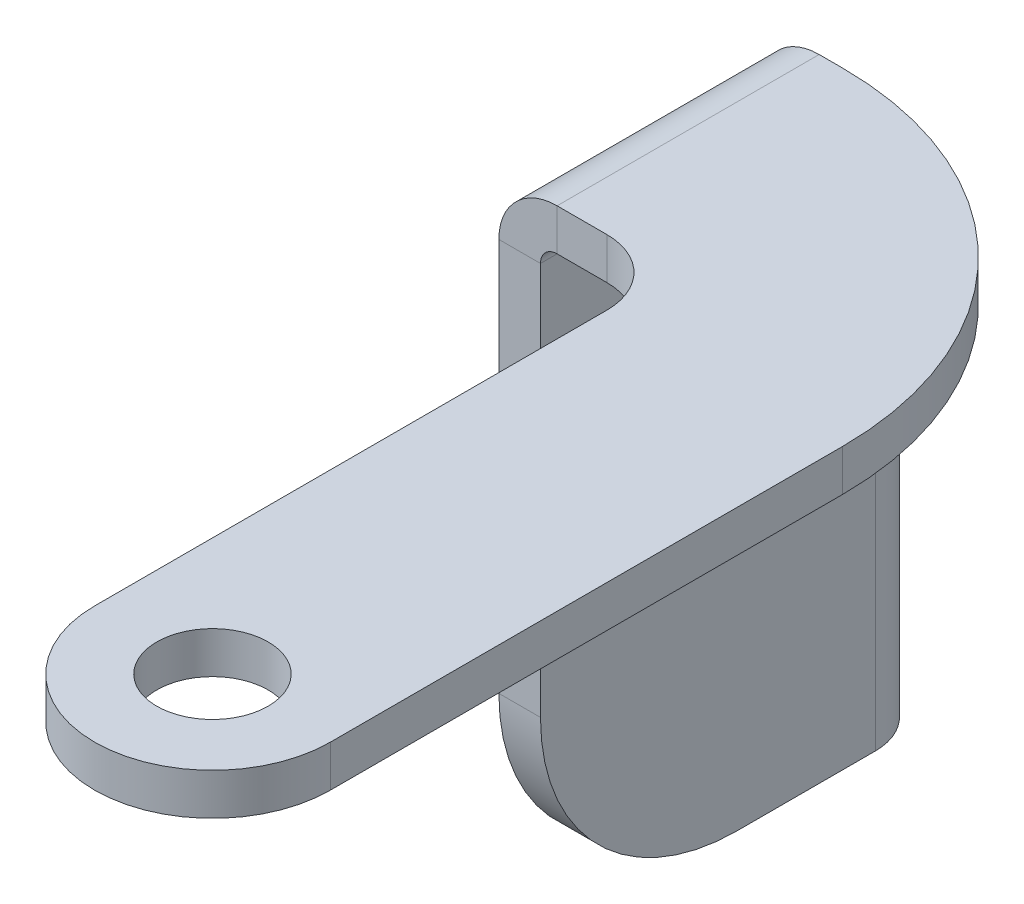
ISO-10303-21;
HEADER;
FILE_DESCRIPTION(('STEP AP214'),'2;1');
FILE_NAME('part.step','',(''),(''),'','','');
FILE_SCHEMA(('AUTOMOTIVE_DESIGN { 1 0 10303 214 1 1 1 1 }'));
ENDSEC;
DATA;
#1=APPLICATION_CONTEXT('core data for automotive mechanical design processes');
#2=APPLICATION_PROTOCOL_DEFINITION('international standard','automotive_design',2000,#1);
#3=PRODUCT_CONTEXT('',#1,'mechanical');
#4=PRODUCT('Part','Part','',(#3));
#5=PRODUCT_RELATED_PRODUCT_CATEGORY('part','',(#4));
#6=PRODUCT_DEFINITION_FORMATION('','',#4);
#7=PRODUCT_DEFINITION_CONTEXT('part definition',#1,'design');
#8=PRODUCT_DEFINITION('design','',#6,#7);
#9=PRODUCT_DEFINITION_SHAPE('','',#8);
#10=(LENGTH_UNIT() NAMED_UNIT(*) SI_UNIT(.MILLI.,.METRE.));
#11=(NAMED_UNIT(*) PLANE_ANGLE_UNIT() SI_UNIT($,.RADIAN.));
#12=(NAMED_UNIT(*) SI_UNIT($,.STERADIAN.) SOLID_ANGLE_UNIT());
#13=UNCERTAINTY_MEASURE_WITH_UNIT(LENGTH_MEASURE(1.E-05),#10,'distance_accuracy_value','');
#14=(GEOMETRIC_REPRESENTATION_CONTEXT(3) GLOBAL_UNCERTAINTY_ASSIGNED_CONTEXT((#13)) GLOBAL_UNIT_ASSIGNED_CONTEXT((#10,
#11,#12)) REPRESENTATION_CONTEXT('',''));
#15=CARTESIAN_POINT('',(0.,0.,0.));
#16=DIRECTION('',(0.,0.,1.));
#17=DIRECTION('',(1.,0.,0.));
#18=AXIS2_PLACEMENT_3D('',#15,#16,#17);
#19=CARTESIAN_POINT('',(16.945,5.,11.825));
#20=DIRECTION('',(-1.,0.,0.));
#21=DIRECTION('',(0.,0.,1.));
#22=AXIS2_PLACEMENT_3D('',#19,#20,#21);
#23=PLANE('',#22);
#24=DIRECTION('',(0.,0.,1.));
#25=VECTOR('',#24,1.);
#26=CARTESIAN_POINT('',(16.9450000000001,35.0051999999999,26.825));
#27=LINE('',#26,#25);
#28=CARTESIAN_POINT('',(16.9450000000001,35.0051999999999,26.825));
#29=VERTEX_POINT('',#28);
#30=CARTESIAN_POINT('',(16.945,35.0051999999999,6.82499999999999));
#31=VERTEX_POINT('',#30);
#32=EDGE_CURVE('E308',#29,#31,#27,.F.);
#33=ORIENTED_EDGE('',*,*,#32,.F.);
#34=DIRECTION('',(0.,-1.,0.));
#35=VECTOR('',#34,1.);
#36=CARTESIAN_POINT('',(16.9450000000001,5.,26.825));
#37=LINE('',#36,#35);
#38=CARTESIAN_POINT('',(16.9450000000001,5.,26.825));
#39=VERTEX_POINT('',#38);
#40=EDGE_CURVE('E332',#29,#39,#37,.T.);
#41=ORIENTED_EDGE('',*,*,#40,.T.);
#42=CARTESIAN_POINT('',(16.945,5.,11.825));
#43=DIRECTION('',(-1.,0.,0.));
#44=DIRECTION('',(0.,0.,1.));
#45=AXIS2_PLACEMENT_3D('',#42,#43,#44);
#46=CIRCLE('',#45,15.);
#47=CARTESIAN_POINT('',(16.945,-10.,11.825));
#48=VERTEX_POINT('',#47);
#49=EDGE_CURVE('E321',#39,#48,#46,.F.);
#50=ORIENTED_EDGE('',*,*,#49,.T.);
#51=DIRECTION('',(0.,0.,-1.));
#52=VECTOR('',#51,1.);
#53=CARTESIAN_POINT('',(16.945,-10.,11.825));
#54=LINE('',#53,#52);
#55=CARTESIAN_POINT('',(16.945,-10.,1.26999999999998));
#56=VERTEX_POINT('',#55);
#57=EDGE_CURVE('E341',#48,#56,#54,.T.);
#58=ORIENTED_EDGE('',*,*,#57,.T.);
#59=DIRECTION('',(0.,1.,0.));
#60=VECTOR('',#59,1.);
#61=CARTESIAN_POINT('',(16.945,-10.,1.26999999999998));
#62=LINE('',#61,#60);
#63=CARTESIAN_POINT('',(16.945,10.,1.26999999999998));
#64=VERTEX_POINT('',#63);
#65=EDGE_CURVE('E358',#64,#56,#62,.F.);
#66=ORIENTED_EDGE('',*,*,#65,.F.);
#67=DIRECTION('',(0.,0.,1.));
#68=VECTOR('',#67,1.);
#69=CARTESIAN_POINT('',(16.945,10.,11.825));
#70=LINE('',#69,#68);
#71=CARTESIAN_POINT('',(16.945,10.,1.82499999999999));
#72=VERTEX_POINT('',#71);
#73=EDGE_CURVE('E339',#64,#72,#70,.T.);
#74=ORIENTED_EDGE('',*,*,#73,.T.);
#75=CARTESIAN_POINT('',(16.945,15.,1.82499999999999));
#76=DIRECTION('',(-1.,0.,0.));
#77=DIRECTION('',(0.,0.,1.));
#78=AXIS2_PLACEMENT_3D('',#75,#76,#77);
#79=CIRCLE('',#78,5.);
#80=CARTESIAN_POINT('',(16.945,15.,6.82499999999999));
#81=VERTEX_POINT('',#80);
#82=EDGE_CURVE('E337',#72,#81,#79,.T.);
#83=ORIENTED_EDGE('',*,*,#82,.T.);
#84=DIRECTION('',(0.,1.,0.));
#85=VECTOR('',#84,1.);
#86=CARTESIAN_POINT('',(16.945,5.,6.82499999999999));
#87=LINE('',#86,#85);
#88=EDGE_CURVE('E334',#81,#31,#87,.T.);
#89=ORIENTED_EDGE('',*,*,#88,.T.);
#90=EDGE_LOOP('',(#33,#41,#50,#58,#66,#74,#83,#89));
#91=FACE_BOUND('',#90,.T.);
#92=ADVANCED_FACE('F79',(#91),#23,.F.);
#93=CARTESIAN_POINT('',(13.77,5.,11.825));
#94=DIRECTION('',(-1.,0.,0.));
#95=DIRECTION('',(0.,0.,1.));
#96=AXIS2_PLACEMENT_3D('',#93,#94,#95);
#97=PLANE('',#96);
#98=DIRECTION('',(0.,1.,0.));
#99=VECTOR('',#98,1.);
#100=CARTESIAN_POINT('',(13.7700000000001,5.,26.825));
#101=LINE('',#100,#99);
#102=CARTESIAN_POINT('',(13.7700000000001,35.0051999999999,26.825));
#103=VERTEX_POINT('',#102);
#104=CARTESIAN_POINT('',(13.7700000000001,5.,26.825));
#105=VERTEX_POINT('',#104);
#106=EDGE_CURVE('E346',#103,#105,#101,.F.);
#107=ORIENTED_EDGE('',*,*,#106,.F.);
#108=DIRECTION('',(0.,0.,1.));
#109=VECTOR('',#108,1.);
#110=CARTESIAN_POINT('',(13.7700000000001,35.0051999999999,26.825));
#111=LINE('',#110,#109);
#112=CARTESIAN_POINT('',(13.77,35.0051999999999,6.825));
#113=VERTEX_POINT('',#112);
#114=EDGE_CURVE('E297',#103,#113,#111,.F.);
#115=ORIENTED_EDGE('',*,*,#114,.T.);
#116=DIRECTION('',(0.,-1.,0.));
#117=VECTOR('',#116,1.);
#118=CARTESIAN_POINT('',(13.77,15.,6.825));
#119=LINE('',#118,#117);
#120=CARTESIAN_POINT('',(13.77,15.,6.825));
#121=VERTEX_POINT('',#120);
#122=EDGE_CURVE('E348',#121,#113,#119,.F.);
#123=ORIENTED_EDGE('',*,*,#122,.F.);
#124=CARTESIAN_POINT('',(13.77,15.,1.825));
#125=DIRECTION('',(-1.,0.,0.));
#126=DIRECTION('',(0.,0.,1.));
#127=AXIS2_PLACEMENT_3D('',#124,#125,#126);
#128=CIRCLE('',#127,5.);
#129=CARTESIAN_POINT('',(13.77,10.,1.825));
#130=VERTEX_POINT('',#129);
#131=EDGE_CURVE('E351',#130,#121,#128,.T.);
#132=ORIENTED_EDGE('',*,*,#131,.F.);
#133=DIRECTION('',(0.,0.,-1.));
#134=VECTOR('',#133,1.);
#135=CARTESIAN_POINT('',(13.77,10.,0.));
#136=LINE('',#135,#134);
#137=CARTESIAN_POINT('',(13.77,10.,1.26999999999999));
#138=VERTEX_POINT('',#137);
#139=EDGE_CURVE('E353',#138,#130,#136,.F.);
#140=ORIENTED_EDGE('',*,*,#139,.F.);
#141=DIRECTION('',(0.,1.,0.));
#142=VECTOR('',#141,1.);
#143=CARTESIAN_POINT('',(13.77,-10.,1.27));
#144=LINE('',#143,#142);
#145=CARTESIAN_POINT('',(13.77,-10.,1.27));
#146=VERTEX_POINT('',#145);
#147=EDGE_CURVE('E363',#146,#138,#144,.T.);
#148=ORIENTED_EDGE('',*,*,#147,.F.);
#149=DIRECTION('',(0.,0.,1.));
#150=VECTOR('',#149,1.);
#151=CARTESIAN_POINT('',(13.77,-10.,0.));
#152=LINE('',#151,#150);
#153=CARTESIAN_POINT('',(13.77,-10.,11.825));
#154=VERTEX_POINT('',#153);
#155=EDGE_CURVE('E355',#154,#146,#152,.F.);
#156=ORIENTED_EDGE('',*,*,#155,.F.);
#157=CARTESIAN_POINT('',(13.77,5.,11.825));
#158=DIRECTION('',(-1.,0.,0.));
#159=DIRECTION('',(0.,0.,1.));
#160=AXIS2_PLACEMENT_3D('',#157,#158,#159);
#161=CIRCLE('',#160,15.);
#162=EDGE_CURVE('E344',#105,#154,#161,.F.);
#163=ORIENTED_EDGE('',*,*,#162,.F.);
#164=EDGE_LOOP('',(#107,#115,#123,#132,#140,#148,#156,#163));
#165=FACE_BOUND('',#164,.T.);
#166=ADVANCED_FACE('F419',(#165),#97,.T.);
#167=CARTESIAN_POINT('',(16.945,15.,6.82499999999999));
#168=DIRECTION('',(0.,0.,1.));
#169=DIRECTION('',(1.,0.,0.));
#170=AXIS2_PLACEMENT_3D('',#167,#168,#169);
#171=PLANE('',#170);
#172=DIRECTION('',(-1.,0.,0.));
#173=VECTOR('',#172,1.);
#174=CARTESIAN_POINT('',(16.945,35.0051999999999,6.82499999999999));
#175=LINE('',#174,#173);
#176=EDGE_CURVE('E312',#31,#113,#175,.T.);
#177=ORIENTED_EDGE('',*,*,#176,.F.);
#178=ORIENTED_EDGE('',*,*,#88,.F.);
#179=DIRECTION('',(-1.,0.,0.));
#180=VECTOR('',#179,1.);
#181=CARTESIAN_POINT('',(16.945,15.,6.82499999999999));
#182=LINE('',#181,#180);
#183=EDGE_CURVE('E324',#81,#121,#182,.T.);
#184=ORIENTED_EDGE('',*,*,#183,.T.);
#185=ORIENTED_EDGE('',*,*,#122,.T.);
#186=EDGE_LOOP('',(#177,#178,#184,#185));
#187=FACE_BOUND('',#186,.T.);
#188=ADVANCED_FACE('F480',(#187),#171,.F.);
#189=CARTESIAN_POINT('',(16.9450000000001,5.,26.825));
#190=DIRECTION('',(0.,0.,-1.));
#191=DIRECTION('',(-1.,0.,0.));
#192=AXIS2_PLACEMENT_3D('',#189,#190,#191);
#193=PLANE('',#192);
#194=DIRECTION('',(-1.,0.,0.));
#195=VECTOR('',#194,1.);
#196=CARTESIAN_POINT('',(16.9450000000001,35.0051999999999,26.825));
#197=LINE('',#196,#195);
#198=EDGE_CURVE('E302',#29,#103,#197,.T.);
#199=ORIENTED_EDGE('',*,*,#198,.T.);
#200=ORIENTED_EDGE('',*,*,#106,.T.);
#201=DIRECTION('',(-1.,0.,0.));
#202=VECTOR('',#201,1.);
#203=CARTESIAN_POINT('',(16.9450000000001,5.,26.825));
#204=LINE('',#203,#202);
#205=EDGE_CURVE('E320',#39,#105,#204,.T.);
#206=ORIENTED_EDGE('',*,*,#205,.F.);
#207=ORIENTED_EDGE('',*,*,#40,.F.);
#208=EDGE_LOOP('',(#199,#200,#206,#207));
#209=FACE_BOUND('',#208,.T.);
#210=ADVANCED_FACE('F432',(#209),#193,.F.);
#211=CARTESIAN_POINT('',(0.,-10.,-3.175));
#212=DIRECTION('',(0.,-1.,0.));
#213=DIRECTION('',(1.,0.,0.));
#214=AXIS2_PLACEMENT_3D('',#211,#212,#213);
#215=PLANE('',#214);
#216=DIRECTION('',(1.,0.,0.));
#217=VECTOR('',#216,1.);
#218=CARTESIAN_POINT('',(0.,-10.,0.));
#219=LINE('',#218,#217);
#220=CARTESIAN_POINT('',(0.,-10.,0.));
#221=VERTEX_POINT('',#220);
#222=CARTESIAN_POINT('',(12.5,-10.,0.));
#223=VERTEX_POINT('',#222);
#224=EDGE_CURVE('E387',#221,#223,#219,.T.);
#225=ORIENTED_EDGE('',*,*,#224,.F.);
#226=DIRECTION('',(0.,0.,1.));
#227=VECTOR('',#226,1.);
#228=CARTESIAN_POINT('',(0.,-10.,-3.175));
#229=LINE('',#228,#227);
#230=CARTESIAN_POINT('',(0.,-10.,-3.175));
#231=VERTEX_POINT('',#230);
#232=EDGE_CURVE('E88',#231,#221,#229,.T.);
#233=ORIENTED_EDGE('',*,*,#232,.F.);
#234=DIRECTION('',(1.,0.,0.));
#235=VECTOR('',#234,1.);
#236=CARTESIAN_POINT('',(0.,-10.,-3.175));
#237=LINE('',#236,#235);
#238=CARTESIAN_POINT('',(12.5,-10.,-3.175));
#239=VERTEX_POINT('',#238);
#240=EDGE_CURVE('E392',#231,#239,#237,.T.);
#241=ORIENTED_EDGE('',*,*,#240,.T.);
#242=DIRECTION('',(0.,0.,1.));
#243=VECTOR('',#242,1.);
#244=CARTESIAN_POINT('',(12.5,-10.,-3.175));
#245=LINE('',#244,#243);
#246=EDGE_CURVE('E13',#239,#223,#245,.T.);
#247=ORIENTED_EDGE('',*,*,#246,.T.);
#248=EDGE_LOOP('',(#225,#233,#241,#247));
#249=FACE_BOUND('',#248,.T.);
#250=ADVANCED_FACE('F490',(#249),#215,.T.);
#251=CARTESIAN_POINT('',(0.,0.,-3.175));
#252=DIRECTION('',(0.,0.,1.));
#253=DIRECTION('',(1.,0.,0.));
#254=AXIS2_PLACEMENT_3D('',#251,#252,#253);
#255=CYLINDRICAL_SURFACE('',#254,10.);
#256=CARTESIAN_POINT('',(0.,0.,0.));
#257=DIRECTION('',(0.,0.,1.));
#258=DIRECTION('',(1.,0.,0.));
#259=AXIS2_PLACEMENT_3D('',#256,#257,#258);
#260=CIRCLE('',#259,10.);
#261=CARTESIAN_POINT('',(0.,10.,0.));
#262=VERTEX_POINT('',#261);
#263=EDGE_CURVE('E399',#262,#221,#260,.T.);
#264=ORIENTED_EDGE('',*,*,#263,.F.);
#265=DIRECTION('',(0.,0.,1.));
#266=VECTOR('',#265,1.);
#267=CARTESIAN_POINT('',(0.,10.,-3.175));
#268=LINE('',#267,#266);
#269=CARTESIAN_POINT('',(0.,10.,-3.175));
#270=VERTEX_POINT('',#269);
#271=EDGE_CURVE('E130',#270,#262,#268,.T.);
#272=ORIENTED_EDGE('',*,*,#271,.F.);
#273=CARTESIAN_POINT('',(0.,0.,-3.175));
#274=DIRECTION('',(0.,0.,1.));
#275=DIRECTION('',(1.,0.,0.));
#276=AXIS2_PLACEMENT_3D('',#273,#274,#275);
#277=CIRCLE('',#276,10.);
#278=EDGE_CURVE('E390',#270,#231,#277,.T.);
#279=ORIENTED_EDGE('',*,*,#278,.T.);
#280=ORIENTED_EDGE('',*,*,#232,.T.);
#281=EDGE_LOOP('',(#264,#272,#279,#280));
#282=FACE_BOUND('',#281,.T.);
#283=ADVANCED_FACE('F528',(#282),#255,.T.);
#284=CARTESIAN_POINT('',(12.5,10.,-3.175));
#285=DIRECTION('',(0.,1.,0.));
#286=DIRECTION('',(-1.,0.,0.));
#287=AXIS2_PLACEMENT_3D('',#284,#285,#286);
#288=PLANE('',#287);
#289=DIRECTION('',(-1.,0.,0.));
#290=VECTOR('',#289,1.);
#291=CARTESIAN_POINT('',(12.5,10.,0.));
#292=LINE('',#291,#290);
#293=CARTESIAN_POINT('',(12.5,10.,0.));
#294=VERTEX_POINT('',#293);
#295=EDGE_CURVE('E396',#294,#262,#292,.T.);
#296=ORIENTED_EDGE('',*,*,#295,.F.);
#297=DIRECTION('',(0.,0.,1.));
#298=VECTOR('',#297,1.);
#299=CARTESIAN_POINT('',(12.5,10.,-3.175));
#300=LINE('',#299,#298);
#301=CARTESIAN_POINT('',(12.5,10.,-3.175));
#302=VERTEX_POINT('',#301);
#303=EDGE_CURVE('E83',#302,#294,#300,.T.);
#304=ORIENTED_EDGE('',*,*,#303,.F.);
#305=DIRECTION('',(-1.,0.,0.));
#306=VECTOR('',#305,1.);
#307=CARTESIAN_POINT('',(12.5,10.,-3.175));
#308=LINE('',#307,#306);
#309=EDGE_CURVE('E386',#302,#270,#308,.T.);
#310=ORIENTED_EDGE('',*,*,#309,.T.);
#311=ORIENTED_EDGE('',*,*,#271,.T.);
#312=EDGE_LOOP('',(#296,#304,#310,#311));
#313=FACE_BOUND('',#312,.T.);
#314=ADVANCED_FACE('F81',(#313),#288,.T.);
#315=CARTESIAN_POINT('',(0.,0.,-3.175));
#316=DIRECTION('',(0.,0.,1.));
#317=DIRECTION('',(1.,0.,0.));
#318=AXIS2_PLACEMENT_3D('',#315,#316,#317);
#319=PLANE('',#318);
#320=CARTESIAN_POINT('',(0.,0.,-3.175));
#321=DIRECTION('',(0.,0.,1.));
#322=DIRECTION('',(1.,0.,0.));
#323=AXIS2_PLACEMENT_3D('',#320,#321,#322);
#324=CIRCLE('',#323,4.25);
#325=CARTESIAN_POINT('',(4.25,0.,-3.175));
#326=VERTEX_POINT('',#325);
#327=EDGE_CURVE('E379',#326,#326,#324,.T.);
#328=ORIENTED_EDGE('',*,*,#327,.T.);
#329=EDGE_LOOP('',(#328));
#330=FACE_BOUND('',#329,.T.);
#331=DIRECTION('',(0.,1.,0.));
#332=VECTOR('',#331,1.);
#333=CARTESIAN_POINT('',(12.5,-10.,-3.175));
#334=LINE('',#333,#332);
#335=EDGE_CURVE('E105',#239,#302,#334,.T.);
#336=ORIENTED_EDGE('',*,*,#335,.F.);
#337=ORIENTED_EDGE('',*,*,#240,.F.);
#338=ORIENTED_EDGE('',*,*,#278,.F.);
#339=ORIENTED_EDGE('',*,*,#309,.F.);
#340=EDGE_LOOP('',(#336,#337,#338,#339));
#341=FACE_BOUND('',#340,.T.);
#342=ADVANCED_FACE('F520',(#330,#341),#319,.F.);
#343=CARTESIAN_POINT('',(0.,0.,0.));
#344=DIRECTION('',(0.,0.,1.));
#345=DIRECTION('',(1.,0.,0.));
#346=AXIS2_PLACEMENT_3D('',#343,#344,#345);
#347=PLANE('',#346);
#348=CARTESIAN_POINT('',(0.,0.,0.));
#349=DIRECTION('',(0.,0.,1.));
#350=DIRECTION('',(1.,0.,0.));
#351=AXIS2_PLACEMENT_3D('',#348,#349,#350);
#352=CIRCLE('',#351,4.25);
#353=CARTESIAN_POINT('',(4.25,0.,0.));
#354=VERTEX_POINT('',#353);
#355=EDGE_CURVE('E370',#354,#354,#352,.T.);
#356=ORIENTED_EDGE('',*,*,#355,.F.);
#357=EDGE_LOOP('',(#356));
#358=FACE_BOUND('',#357,.T.);
#359=DIRECTION('',(0.,1.,0.));
#360=VECTOR('',#359,1.);
#361=CARTESIAN_POINT('',(12.5,-10.,0.));
#362=LINE('',#361,#360);
#363=EDGE_CURVE('E382',#223,#294,#362,.T.);
#364=ORIENTED_EDGE('',*,*,#363,.T.);
#365=ORIENTED_EDGE('',*,*,#295,.T.);
#366=ORIENTED_EDGE('',*,*,#263,.T.);
#367=ORIENTED_EDGE('',*,*,#224,.T.);
#368=EDGE_LOOP('',(#364,#365,#366,#367));
#369=FACE_BOUND('',#368,.T.);
#370=ADVANCED_FACE('F518',(#358,#369),#347,.T.);
#371=CARTESIAN_POINT('',(0.,0.,-3.175));
#372=DIRECTION('',(0.,0.,1.));
#373=DIRECTION('',(1.,0.,0.));
#374=AXIS2_PLACEMENT_3D('',#371,#372,#373);
#375=CYLINDRICAL_SURFACE('',#374,4.25);
#376=ORIENTED_EDGE('',*,*,#327,.F.);
#377=EDGE_LOOP('',(#376));
#378=FACE_BOUND('',#377,.T.);
#379=ORIENTED_EDGE('',*,*,#355,.T.);
#380=EDGE_LOOP('',(#379));
#381=FACE_BOUND('',#380,.T.);
#382=ADVANCED_FACE('F512',(#378,#381),#375,.F.);
#383=CARTESIAN_POINT('',(12.5,-10.,1.27));
#384=DIRECTION('',(0.,-1.,0.));
#385=DIRECTION('',(0.,0.,-1.));
#386=AXIS2_PLACEMENT_3D('',#383,#384,#385);
#387=PLANE('',#386);
#388=DIRECTION('',(-1.,0.,0.));
#389=VECTOR('',#388,1.);
#390=CARTESIAN_POINT('',(16.945,-10.,1.26999999999998));
#391=LINE('',#390,#389);
#392=EDGE_CURVE('E314',#146,#56,#391,.F.);
#393=ORIENTED_EDGE('',*,*,#392,.F.);
#394=CARTESIAN_POINT('',(12.5,-10.,1.27));
#395=DIRECTION('',(0.,1.,0.));
#396=DIRECTION('',(0.,0.,1.));
#397=AXIS2_PLACEMENT_3D('',#394,#395,#396);
#398=CIRCLE('',#397,1.27);
#399=EDGE_CURVE('E374',#223,#146,#398,.F.);
#400=ORIENTED_EDGE('',*,*,#399,.F.);
#401=ORIENTED_EDGE('',*,*,#246,.F.);
#402=CARTESIAN_POINT('',(12.5,-10.,1.27));
#403=DIRECTION('',(0.,1.,0.));
#404=DIRECTION('',(0.,0.,1.));
#405=AXIS2_PLACEMENT_3D('',#402,#403,#404);
#406=CIRCLE('',#405,4.445);
#407=EDGE_CURVE('E367',#239,#56,#406,.F.);
#408=ORIENTED_EDGE('',*,*,#407,.T.);
#409=EDGE_LOOP('',(#393,#400,#401,#408));
#410=FACE_BOUND('',#409,.T.);
#411=ADVANCED_FACE('F509',(#410),#387,.T.);
#412=CARTESIAN_POINT('',(12.5,10.,1.27));
#413=DIRECTION('',(0.,-1.,0.));
#414=DIRECTION('',(0.,0.,-1.));
#415=AXIS2_PLACEMENT_3D('',#412,#413,#414);
#416=PLANE('',#415);
#417=CARTESIAN_POINT('',(12.5,10.,1.27));
#418=DIRECTION('',(0.,1.,0.));
#419=DIRECTION('',(0.,0.,1.));
#420=AXIS2_PLACEMENT_3D('',#417,#418,#419);
#421=CIRCLE('',#420,1.27);
#422=EDGE_CURVE('E330',#138,#294,#421,.T.);
#423=ORIENTED_EDGE('',*,*,#422,.F.);
#424=DIRECTION('',(-1.,0.,0.));
#425=VECTOR('',#424,1.);
#426=CARTESIAN_POINT('',(13.77,10.,1.26999999999999));
#427=LINE('',#426,#425);
#428=EDGE_CURVE('E360',#138,#64,#427,.F.);
#429=ORIENTED_EDGE('',*,*,#428,.T.);
#430=CARTESIAN_POINT('',(12.5,10.,1.27));
#431=DIRECTION('',(0.,1.,0.));
#432=DIRECTION('',(0.,0.,1.));
#433=AXIS2_PLACEMENT_3D('',#430,#431,#432);
#434=CIRCLE('',#433,4.445);
#435=EDGE_CURVE('E371',#64,#302,#434,.T.);
#436=ORIENTED_EDGE('',*,*,#435,.T.);
#437=ORIENTED_EDGE('',*,*,#303,.T.);
#438=EDGE_LOOP('',(#423,#429,#436,#437));
#439=FACE_BOUND('',#438,.T.);
#440=ADVANCED_FACE('F408',(#439),#416,.F.);
#441=CARTESIAN_POINT('',(12.5,10.,1.27));
#442=DIRECTION('',(0.,1.,0.));
#443=DIRECTION('',(1.,0.,0.));
#444=AXIS2_PLACEMENT_3D('',#441,#442,#443);
#445=CYLINDRICAL_SURFACE('',#444,4.445);
#446=ORIENTED_EDGE('',*,*,#335,.T.);
#447=ORIENTED_EDGE('',*,*,#435,.F.);
#448=ORIENTED_EDGE('',*,*,#65,.T.);
#449=ORIENTED_EDGE('',*,*,#407,.F.);
#450=EDGE_LOOP('',(#446,#447,#448,#449));
#451=FACE_BOUND('',#450,.T.);
#452=ADVANCED_FACE('F503',(#451),#445,.T.);
#453=CARTESIAN_POINT('',(12.5,10.,1.27));
#454=DIRECTION('',(0.,1.,0.));
#455=DIRECTION('',(1.,0.,0.));
#456=AXIS2_PLACEMENT_3D('',#453,#454,#455);
#457=CYLINDRICAL_SURFACE('',#456,1.27);
#458=ORIENTED_EDGE('',*,*,#363,.F.);
#459=ORIENTED_EDGE('',*,*,#399,.T.);
#460=ORIENTED_EDGE('',*,*,#147,.T.);
#461=ORIENTED_EDGE('',*,*,#422,.T.);
#462=EDGE_LOOP('',(#458,#459,#460,#461));
#463=FACE_BOUND('',#462,.T.);
#464=ADVANCED_FACE('F412',(#463),#457,.F.);
#465=CARTESIAN_POINT('',(16.945,-10.,0.));
#466=DIRECTION('',(0.,1.,0.));
#467=DIRECTION('',(0.,0.,1.));
#468=AXIS2_PLACEMENT_3D('',#465,#466,#467);
#469=PLANE('',#468);
#470=ORIENTED_EDGE('',*,*,#392,.T.);
#471=ORIENTED_EDGE('',*,*,#57,.F.);
#472=DIRECTION('',(-1.,0.,0.));
#473=VECTOR('',#472,1.);
#474=CARTESIAN_POINT('',(16.945,-10.,11.825));
#475=LINE('',#474,#473);
#476=EDGE_CURVE('E317',#48,#154,#475,.T.);
#477=ORIENTED_EDGE('',*,*,#476,.T.);
#478=ORIENTED_EDGE('',*,*,#155,.T.);
#479=EDGE_LOOP('',(#470,#471,#477,#478));
#480=FACE_BOUND('',#479,.T.);
#481=ADVANCED_FACE('F423',(#480),#469,.F.);
#482=CARTESIAN_POINT('',(16.945,10.,0.));
#483=DIRECTION('',(0.,-1.,0.));
#484=DIRECTION('',(0.,0.,-1.));
#485=AXIS2_PLACEMENT_3D('',#482,#483,#484);
#486=PLANE('',#485);
#487=ORIENTED_EDGE('',*,*,#428,.F.);
#488=ORIENTED_EDGE('',*,*,#139,.T.);
#489=DIRECTION('',(-1.,0.,0.));
#490=VECTOR('',#489,1.);
#491=CARTESIAN_POINT('',(16.945,10.,1.82499999999999));
#492=LINE('',#491,#490);
#493=EDGE_CURVE('E327',#72,#130,#492,.T.);
#494=ORIENTED_EDGE('',*,*,#493,.F.);
#495=ORIENTED_EDGE('',*,*,#73,.F.);
#496=EDGE_LOOP('',(#487,#488,#494,#495));
#497=FACE_BOUND('',#496,.T.);
#498=ADVANCED_FACE('F496',(#497),#486,.F.);
#499=CARTESIAN_POINT('',(16.945,15.,1.82499999999999));
#500=DIRECTION('',(-1.,0.,0.));
#501=DIRECTION('',(0.,0.,1.));
#502=AXIS2_PLACEMENT_3D('',#499,#500,#501);
#503=CYLINDRICAL_SURFACE('',#502,5.);
#504=ORIENTED_EDGE('',*,*,#131,.T.);
#505=ORIENTED_EDGE('',*,*,#183,.F.);
#506=ORIENTED_EDGE('',*,*,#82,.F.);
#507=ORIENTED_EDGE('',*,*,#493,.T.);
#508=EDGE_LOOP('',(#504,#505,#506,#507));
#509=FACE_BOUND('',#508,.T.);
#510=ADVANCED_FACE('F487',(#509),#503,.F.);
#511=CARTESIAN_POINT('',(16.945,5.,11.825));
#512=DIRECTION('',(-1.,0.,0.));
#513=DIRECTION('',(0.,0.,1.));
#514=AXIS2_PLACEMENT_3D('',#511,#512,#513);
#515=CYLINDRICAL_SURFACE('',#514,15.);
#516=ORIENTED_EDGE('',*,*,#162,.T.);
#517=ORIENTED_EDGE('',*,*,#476,.F.);
#518=ORIENTED_EDGE('',*,*,#49,.F.);
#519=ORIENTED_EDGE('',*,*,#205,.T.);
#520=EDGE_LOOP('',(#516,#517,#518,#519));
#521=FACE_BOUND('',#520,.T.);
#522=ADVANCED_FACE('F428',(#521),#515,.T.);
#523=CARTESIAN_POINT('',(18.215,35.0051999999999,6.82499999999998));
#524=DIRECTION('',(0.,0.,-1.));
#525=DIRECTION('',(-1.,0.,0.));
#526=AXIS2_PLACEMENT_3D('',#523,#524,#525);
#527=PLANE('',#526);
#528=DIRECTION('',(0.,1.,0.));
#529=VECTOR('',#528,1.);
#530=CARTESIAN_POINT('',(18.215,36.2751999999999,6.82499999999998));
#531=LINE('',#530,#529);
#532=CARTESIAN_POINT('',(18.215,36.2751999999999,6.82499999999998));
#533=VERTEX_POINT('',#532);
#534=CARTESIAN_POINT('',(18.215,39.4501999999999,6.82499999999998));
#535=VERTEX_POINT('',#534);
#536=EDGE_CURVE('E234',#533,#535,#531,.T.);
#537=ORIENTED_EDGE('',*,*,#536,.F.);
#538=CARTESIAN_POINT('',(18.215,35.0051999999999,6.82499999999998));
#539=DIRECTION('',(0.,0.,1.));
#540=DIRECTION('',(1.,0.,0.));
#541=AXIS2_PLACEMENT_3D('',#538,#539,#540);
#542=CIRCLE('',#541,1.27);
#543=EDGE_CURVE('E305',#31,#533,#542,.F.);
#544=ORIENTED_EDGE('',*,*,#543,.F.);
#545=ORIENTED_EDGE('',*,*,#176,.T.);
#546=CARTESIAN_POINT('',(18.215,35.0051999999999,6.82499999999998));
#547=DIRECTION('',(0.,0.,1.));
#548=DIRECTION('',(1.,0.,0.));
#549=AXIS2_PLACEMENT_3D('',#546,#547,#548);
#550=CIRCLE('',#549,4.445);
#551=EDGE_CURVE('E96',#113,#535,#550,.F.);
#552=ORIENTED_EDGE('',*,*,#551,.T.);
#553=EDGE_LOOP('',(#537,#544,#545,#552));
#554=FACE_BOUND('',#553,.T.);
#555=ADVANCED_FACE('F486',(#554),#527,.T.);
#556=CARTESIAN_POINT('',(18.2150000000001,35.0051999999999,26.825));
#557=DIRECTION('',(0.,0.,-1.));
#558=DIRECTION('',(-1.,0.,0.));
#559=AXIS2_PLACEMENT_3D('',#556,#557,#558);
#560=PLANE('',#559);
#561=CARTESIAN_POINT('',(18.2150000000001,35.0051999999999,26.825));
#562=DIRECTION('',(0.,0.,1.));
#563=DIRECTION('',(1.,0.,0.));
#564=AXIS2_PLACEMENT_3D('',#561,#562,#563);
#565=CIRCLE('',#564,1.27);
#566=CARTESIAN_POINT('',(18.2150000000001,36.2751999999999,26.825));
#567=VERTEX_POINT('',#566);
#568=EDGE_CURVE('E289',#567,#29,#565,.T.);
#569=ORIENTED_EDGE('',*,*,#568,.F.);
#570=DIRECTION('',(0.,1.,0.));
#571=VECTOR('',#570,1.);
#572=CARTESIAN_POINT('',(18.2150000000001,36.2751999999999,26.825));
#573=LINE('',#572,#571);
#574=CARTESIAN_POINT('',(18.215,39.4501999999999,26.825));
#575=VERTEX_POINT('',#574);
#576=EDGE_CURVE('E445',#567,#575,#573,.T.);
#577=ORIENTED_EDGE('',*,*,#576,.T.);
#578=CARTESIAN_POINT('',(18.2150000000001,35.0051999999999,26.825));
#579=DIRECTION('',(0.,0.,1.));
#580=DIRECTION('',(1.,0.,0.));
#581=AXIS2_PLACEMENT_3D('',#578,#579,#580);
#582=CIRCLE('',#581,4.445);
#583=EDGE_CURVE('E300',#575,#103,#582,.T.);
#584=ORIENTED_EDGE('',*,*,#583,.T.);
#585=ORIENTED_EDGE('',*,*,#198,.F.);
#586=EDGE_LOOP('',(#569,#577,#584,#585));
#587=FACE_BOUND('',#586,.T.);
#588=ADVANCED_FACE('F437',(#587),#560,.F.);
#589=CARTESIAN_POINT('',(18.2150000000001,35.0051999999999,26.825));
#590=DIRECTION('',(0.,0.,1.));
#591=DIRECTION('',(0.,1.,0.));
#592=AXIS2_PLACEMENT_3D('',#589,#590,#591);
#593=CYLINDRICAL_SURFACE('',#592,4.445);
#594=ORIENTED_EDGE('',*,*,#114,.F.);
#595=ORIENTED_EDGE('',*,*,#583,.F.);
#596=DIRECTION('',(0.,0.,1.));
#597=VECTOR('',#596,1.);
#598=CARTESIAN_POINT('',(18.2150000000001,39.4501999999999,31.825));
#599=LINE('',#598,#597);
#600=EDGE_CURVE('E447',#535,#575,#599,.T.);
#601=ORIENTED_EDGE('',*,*,#600,.F.);
#602=ORIENTED_EDGE('',*,*,#551,.F.);
#603=EDGE_LOOP('',(#594,#595,#601,#602));
#604=FACE_BOUND('',#603,.T.);
#605=ADVANCED_FACE('F547',(#604),#593,.T.);
#606=CARTESIAN_POINT('',(18.2150000000001,35.0051999999999,26.825));
#607=DIRECTION('',(0.,0.,1.));
#608=DIRECTION('',(0.,1.,0.));
#609=AXIS2_PLACEMENT_3D('',#606,#607,#608);
#610=CYLINDRICAL_SURFACE('',#609,1.27);
#611=ORIENTED_EDGE('',*,*,#32,.T.);
#612=ORIENTED_EDGE('',*,*,#543,.T.);
#613=DIRECTION('',(0.,0.,1.));
#614=VECTOR('',#613,1.);
#615=CARTESIAN_POINT('',(18.215,36.2751999999999,6.82499999999998));
#616=LINE('',#615,#614);
#617=EDGE_CURVE('E443',#533,#567,#616,.T.);
#618=ORIENTED_EDGE('',*,*,#617,.T.);
#619=ORIENTED_EDGE('',*,*,#568,.T.);
#620=EDGE_LOOP('',(#611,#612,#618,#619));
#621=FACE_BOUND('',#620,.T.);
#622=ADVANCED_FACE('F440',(#621),#610,.F.);
#623=CARTESIAN_POINT('',(16.9450000000001,39.4501999999999,26.825));
#624=DIRECTION('',(0.,0.,1.));
#625=DIRECTION('',(1.,0.,0.));
#626=AXIS2_PLACEMENT_3D('',#623,#624,#625);
#627=PLANE('',#626);
#628=DIRECTION('',(-1.,0.,0.));
#629=VECTOR('',#628,1.);
#630=CARTESIAN_POINT('',(16.9450000000001,39.4501999999999,26.825));
#631=LINE('',#630,#629);
#632=CARTESIAN_POINT('',(22.0125000000005,39.4501999999999,26.825));
#633=VERTEX_POINT('',#632);
#634=EDGE_CURVE('E247',#633,#575,#631,.T.);
#635=ORIENTED_EDGE('',*,*,#634,.T.);
#636=ORIENTED_EDGE('',*,*,#576,.F.);
#637=DIRECTION('',(-1.,0.,0.));
#638=VECTOR('',#637,1.);
#639=CARTESIAN_POINT('',(16.9450000000001,36.2751999999999,26.825));
#640=LINE('',#639,#638);
#641=CARTESIAN_POINT('',(22.0125000000005,36.2751999999999,26.825));
#642=VERTEX_POINT('',#641);
#643=EDGE_CURVE('E239',#642,#567,#640,.T.);
#644=ORIENTED_EDGE('',*,*,#643,.F.);
#645=DIRECTION('',(0.,-1.,0.));
#646=VECTOR('',#645,1.);
#647=CARTESIAN_POINT('',(22.0125000000005,39.4501999999999,26.825));
#648=LINE('',#647,#646);
#649=EDGE_CURVE('E287',#633,#642,#648,.T.);
#650=ORIENTED_EDGE('',*,*,#649,.F.);
#651=EDGE_LOOP('',(#635,#636,#644,#650));
#652=FACE_BOUND('',#651,.T.);
#653=ADVANCED_FACE('F551',(#652),#627,.T.);
#654=CARTESIAN_POINT('',(20.0125000000004,39.4501999999999,6.82499999999998));
#655=DIRECTION('',(0.,0.,-1.));
#656=DIRECTION('',(-1.,0.,0.));
#657=AXIS2_PLACEMENT_3D('',#654,#655,#656);
#658=PLANE('',#657);
#659=DIRECTION('',(1.,0.,0.));
#660=VECTOR('',#659,1.);
#661=CARTESIAN_POINT('',(20.0125000000004,36.2751999999999,6.82499999999998));
#662=LINE('',#661,#660);
#663=CARTESIAN_POINT('',(20.0125000000004,36.2751999999999,6.82499999999998));
#664=VERTEX_POINT('',#663);
#665=EDGE_CURVE('E269',#533,#664,#662,.T.);
#666=ORIENTED_EDGE('',*,*,#665,.F.);
#667=ORIENTED_EDGE('',*,*,#536,.T.);
#668=DIRECTION('',(1.,0.,0.));
#669=VECTOR('',#668,1.);
#670=CARTESIAN_POINT('',(20.0125000000004,39.4501999999999,6.82499999999998));
#671=LINE('',#670,#669);
#672=CARTESIAN_POINT('',(20.0125000000004,39.4501999999999,6.82499999999998));
#673=VERTEX_POINT('',#672);
#674=EDGE_CURVE('E228',#535,#673,#671,.T.);
#675=ORIENTED_EDGE('',*,*,#674,.T.);
#676=DIRECTION('',(0.,-1.,0.));
#677=VECTOR('',#676,1.);
#678=CARTESIAN_POINT('',(20.0125000000004,39.4501999999999,6.82499999999998));
#679=LINE('',#678,#677);
#680=EDGE_CURVE('E232',#673,#664,#679,.T.);
#681=ORIENTED_EDGE('',*,*,#680,.T.);
#682=EDGE_LOOP('',(#666,#667,#675,#681));
#683=FACE_BOUND('',#682,.T.);
#684=ADVANCED_FACE('F231',(#683),#658,.T.);
#685=CARTESIAN_POINT('',(22.0125000000005,39.4501999999999,31.825));
#686=DIRECTION('',(0.,1.,0.));
#687=DIRECTION('',(-1.,0.,0.));
#688=AXIS2_PLACEMENT_3D('',#685,#686,#687);
#689=PLANE('',#688);
#690=CARTESIAN_POINT('',(36.0125000000014,39.4502,70.9254009735169));
#691=DIRECTION('',(0.,-1.,0.));
#692=DIRECTION('',(1.,0.,0.));
#693=AXIS2_PLACEMENT_3D('',#690,#691,#692);
#694=CIRCLE('',#693,4.25);
#695=CARTESIAN_POINT('',(40.2625000000014,39.4502,70.9254009735169));
#696=VERTEX_POINT('',#695);
#697=EDGE_CURVE('E271',#696,#696,#694,.T.);
#698=ORIENTED_EDGE('',*,*,#697,.T.);
#699=EDGE_LOOP('',(#698));
#700=FACE_BOUND('',#699,.T.);
#701=ORIENTED_EDGE('',*,*,#674,.F.);
#702=ORIENTED_EDGE('',*,*,#600,.T.);
#703=ORIENTED_EDGE('',*,*,#634,.F.);
#704=CARTESIAN_POINT('',(22.0125000000005,39.4501999999999,31.825));
#705=DIRECTION('',(0.,1.,0.));
#706=DIRECTION('',(-1.,0.,0.));
#707=AXIS2_PLACEMENT_3D('',#704,#705,#706);
#708=CIRCLE('',#707,5.);
#709=CARTESIAN_POINT('',(27.0125000000005,39.4501999999999,31.8249999999999));
#710=VERTEX_POINT('',#709);
#711=EDGE_CURVE('E264',#710,#633,#708,.T.);
#712=ORIENTED_EDGE('',*,*,#711,.F.);
#713=DIRECTION('',(0.,0.,-1.));
#714=VECTOR('',#713,1.);
#715=CARTESIAN_POINT('',(27.0125000000014,39.4501999999999,70.925400973517));
#716=LINE('',#715,#714);
#717=CARTESIAN_POINT('',(27.0125000000014,39.4501999999999,70.925400973517));
#718=VERTEX_POINT('',#717);
#719=EDGE_CURVE('E261',#718,#710,#716,.T.);
#720=ORIENTED_EDGE('',*,*,#719,.F.);
#721=CARTESIAN_POINT('',(36.0125000000014,39.4502,70.9254009735169));
#722=DIRECTION('',(0.,-1.,0.));
#723=DIRECTION('',(1.,0.,0.));
#724=AXIS2_PLACEMENT_3D('',#721,#722,#723);
#725=CIRCLE('',#724,9.);
#726=CARTESIAN_POINT('',(45.0125000000014,39.4502,70.9254009735169));
#727=VERTEX_POINT('',#726);
#728=EDGE_CURVE('E255',#727,#718,#725,.T.);
#729=ORIENTED_EDGE('',*,*,#728,.F.);
#730=DIRECTION('',(0.,0.,1.));
#731=VECTOR('',#730,1.);
#732=CARTESIAN_POINT('',(45.0125000000005,39.4502,31.8249999999999));
#733=LINE('',#732,#731);
#734=CARTESIAN_POINT('',(45.0125000000005,39.4502,31.825));
#735=VERTEX_POINT('',#734);
#736=EDGE_CURVE('E253',#735,#727,#733,.T.);
#737=ORIENTED_EDGE('',*,*,#736,.F.);
#738=CARTESIAN_POINT('',(20.0125000000005,39.4501999999999,31.825));
#739=DIRECTION('',(0.,-1.,0.));
#740=DIRECTION('',(1.,0.,0.));
#741=AXIS2_PLACEMENT_3D('',#738,#739,#740);
#742=CIRCLE('',#741,25.);
#743=EDGE_CURVE('E238',#673,#735,#742,.T.);
#744=ORIENTED_EDGE('',*,*,#743,.F.);
#745=EDGE_LOOP('',(#701,#702,#703,#712,#720,#729,#737,#744));
#746=FACE_BOUND('',#745,.T.);
#747=ADVANCED_FACE('F250',(#700,#746),#689,.T.);
#748=CARTESIAN_POINT('',(22.0125000000005,36.2751999999999,31.825));
#749=DIRECTION('',(0.,1.,0.));
#750=DIRECTION('',(-1.,0.,0.));
#751=AXIS2_PLACEMENT_3D('',#748,#749,#750);
#752=PLANE('',#751);
#753=CARTESIAN_POINT('',(36.0125000000014,36.2752,70.9254009735169));
#754=DIRECTION('',(0.,-1.,0.));
#755=DIRECTION('',(1.,0.,0.));
#756=AXIS2_PLACEMENT_3D('',#753,#754,#755);
#757=CIRCLE('',#756,4.25);
#758=CARTESIAN_POINT('',(40.2625000000014,36.2752,70.9254009735169));
#759=VERTEX_POINT('',#758);
#760=EDGE_CURVE('E452',#759,#759,#757,.T.);
#761=ORIENTED_EDGE('',*,*,#760,.F.);
#762=EDGE_LOOP('',(#761));
#763=FACE_BOUND('',#762,.T.);
#764=ORIENTED_EDGE('',*,*,#617,.F.);
#765=ORIENTED_EDGE('',*,*,#665,.T.);
#766=CARTESIAN_POINT('',(20.0125000000005,36.2751999999999,31.825));
#767=DIRECTION('',(0.,-1.,0.));
#768=DIRECTION('',(1.,0.,0.));
#769=AXIS2_PLACEMENT_3D('',#766,#767,#768);
#770=CIRCLE('',#769,25.);
#771=CARTESIAN_POINT('',(45.0125000000005,36.2752,31.825));
#772=VERTEX_POINT('',#771);
#773=EDGE_CURVE('E245',#664,#772,#770,.T.);
#774=ORIENTED_EDGE('',*,*,#773,.T.);
#775=DIRECTION('',(0.,0.,1.));
#776=VECTOR('',#775,1.);
#777=CARTESIAN_POINT('',(45.0125000000005,36.2752,31.8249999999999));
#778=LINE('',#777,#776);
#779=CARTESIAN_POINT('',(45.0125000000014,36.2752,70.9254009735169));
#780=VERTEX_POINT('',#779);
#781=EDGE_CURVE('E273',#772,#780,#778,.T.);
#782=ORIENTED_EDGE('',*,*,#781,.T.);
#783=CARTESIAN_POINT('',(36.0125000000014,36.2752,70.9254009735169));
#784=DIRECTION('',(0.,-1.,0.));
#785=DIRECTION('',(1.,0.,0.));
#786=AXIS2_PLACEMENT_3D('',#783,#784,#785);
#787=CIRCLE('',#786,9.);
#788=CARTESIAN_POINT('',(27.0125000000014,36.2751999999999,70.925400973517));
#789=VERTEX_POINT('',#788);
#790=EDGE_CURVE('E276',#780,#789,#787,.T.);
#791=ORIENTED_EDGE('',*,*,#790,.T.);
#792=DIRECTION('',(0.,0.,-1.));
#793=VECTOR('',#792,1.);
#794=CARTESIAN_POINT('',(27.0125000000014,36.2751999999999,70.925400973517));
#795=LINE('',#794,#793);
#796=CARTESIAN_POINT('',(27.0125000000005,36.2751999999999,31.8249999999999));
#797=VERTEX_POINT('',#796);
#798=EDGE_CURVE('E279',#789,#797,#795,.T.);
#799=ORIENTED_EDGE('',*,*,#798,.T.);
#800=CARTESIAN_POINT('',(22.0125000000005,36.2751999999999,31.825));
#801=DIRECTION('',(0.,1.,0.));
#802=DIRECTION('',(-1.,0.,0.));
#803=AXIS2_PLACEMENT_3D('',#800,#801,#802);
#804=CIRCLE('',#803,5.);
#805=EDGE_CURVE('E282',#797,#642,#804,.T.);
#806=ORIENTED_EDGE('',*,*,#805,.T.);
#807=ORIENTED_EDGE('',*,*,#643,.T.);
#808=EDGE_LOOP('',(#764,#765,#774,#782,#791,#799,#806,#807));
#809=FACE_BOUND('',#808,.T.);
#810=ADVANCED_FACE('F459',(#763,#809),#752,.F.);
#811=CARTESIAN_POINT('',(22.0125000000005,39.4501999999999,31.825));
#812=DIRECTION('',(0.,-1.,0.));
#813=DIRECTION('',(1.,0.,0.));
#814=AXIS2_PLACEMENT_3D('',#811,#812,#813);
#815=CYLINDRICAL_SURFACE('',#814,5.);
#816=ORIENTED_EDGE('',*,*,#805,.F.);
#817=DIRECTION('',(0.,-1.,0.));
#818=VECTOR('',#817,1.);
#819=CARTESIAN_POINT('',(27.0125000000005,39.4501999999999,31.8249999999999));
#820=LINE('',#819,#818);
#821=EDGE_CURVE('E290',#710,#797,#820,.T.);
#822=ORIENTED_EDGE('',*,*,#821,.F.);
#823=ORIENTED_EDGE('',*,*,#711,.T.);
#824=ORIENTED_EDGE('',*,*,#649,.T.);
#825=EDGE_LOOP('',(#816,#822,#823,#824));
#826=FACE_BOUND('',#825,.T.);
#827=ADVANCED_FACE('F461',(#826),#815,.F.);
#828=CARTESIAN_POINT('',(27.0125000000014,39.4501999999999,70.925400973517));
#829=DIRECTION('',(-1.,0.,0.));
#830=DIRECTION('',(0.,0.,1.));
#831=AXIS2_PLACEMENT_3D('',#828,#829,#830);
#832=PLANE('',#831);
#833=ORIENTED_EDGE('',*,*,#798,.F.);
#834=DIRECTION('',(0.,-1.,0.));
#835=VECTOR('',#834,1.);
#836=CARTESIAN_POINT('',(27.0125000000014,39.4501999999999,70.925400973517));
#837=LINE('',#836,#835);
#838=EDGE_CURVE('E292',#718,#789,#837,.T.);
#839=ORIENTED_EDGE('',*,*,#838,.F.);
#840=ORIENTED_EDGE('',*,*,#719,.T.);
#841=ORIENTED_EDGE('',*,*,#821,.T.);
#842=EDGE_LOOP('',(#833,#839,#840,#841));
#843=FACE_BOUND('',#842,.T.);
#844=ADVANCED_FACE('F467',(#843),#832,.T.);
#845=CARTESIAN_POINT('',(36.0125000000014,39.4502,70.9254009735169));
#846=DIRECTION('',(0.,-1.,0.));
#847=DIRECTION('',(1.,0.,0.));
#848=AXIS2_PLACEMENT_3D('',#845,#846,#847);
#849=CYLINDRICAL_SURFACE('',#848,9.);
#850=ORIENTED_EDGE('',*,*,#790,.F.);
#851=DIRECTION('',(0.,-1.,0.));
#852=VECTOR('',#851,1.);
#853=CARTESIAN_POINT('',(45.0125000000014,39.4502,70.9254009735169));
#854=LINE('',#853,#852);
#855=EDGE_CURVE('E294',#727,#780,#854,.T.);
#856=ORIENTED_EDGE('',*,*,#855,.F.);
#857=ORIENTED_EDGE('',*,*,#728,.T.);
#858=ORIENTED_EDGE('',*,*,#838,.T.);
#859=EDGE_LOOP('',(#850,#856,#857,#858));
#860=FACE_BOUND('',#859,.T.);
#861=ADVANCED_FACE('F561',(#860),#849,.T.);
#862=CARTESIAN_POINT('',(45.0125000000005,39.4502,31.8249999999999));
#863=DIRECTION('',(1.,0.,0.));
#864=DIRECTION('',(0.,0.,-1.));
#865=AXIS2_PLACEMENT_3D('',#862,#863,#864);
#866=PLANE('',#865);
#867=ORIENTED_EDGE('',*,*,#781,.F.);
#868=DIRECTION('',(0.,-1.,0.));
#869=VECTOR('',#868,1.);
#870=CARTESIAN_POINT('',(45.0125000000005,39.4502,31.825));
#871=LINE('',#870,#869);
#872=EDGE_CURVE('E246',#735,#772,#871,.T.);
#873=ORIENTED_EDGE('',*,*,#872,.F.);
#874=ORIENTED_EDGE('',*,*,#736,.T.);
#875=ORIENTED_EDGE('',*,*,#855,.T.);
#876=EDGE_LOOP('',(#867,#873,#874,#875));
#877=FACE_BOUND('',#876,.T.);
#878=ADVANCED_FACE('F558',(#877),#866,.T.);
#879=CARTESIAN_POINT('',(20.0125000000005,39.4501999999999,31.825));
#880=DIRECTION('',(0.,-1.,0.));
#881=DIRECTION('',(1.,0.,0.));
#882=AXIS2_PLACEMENT_3D('',#879,#880,#881);
#883=CYLINDRICAL_SURFACE('',#882,25.);
#884=ORIENTED_EDGE('',*,*,#773,.F.);
#885=ORIENTED_EDGE('',*,*,#680,.F.);
#886=ORIENTED_EDGE('',*,*,#743,.T.);
#887=ORIENTED_EDGE('',*,*,#872,.T.);
#888=EDGE_LOOP('',(#884,#885,#886,#887));
#889=FACE_BOUND('',#888,.T.);
#890=ADVANCED_FACE('F243',(#889),#883,.T.);
#891=CARTESIAN_POINT('',(36.0125000000014,39.4502,70.9254009735169));
#892=DIRECTION('',(0.,-1.,0.));
#893=DIRECTION('',(1.,0.,0.));
#894=AXIS2_PLACEMENT_3D('',#891,#892,#893);
#895=CYLINDRICAL_SURFACE('',#894,4.25);
#896=ORIENTED_EDGE('',*,*,#697,.F.);
#897=EDGE_LOOP('',(#896));
#898=FACE_BOUND('',#897,.T.);
#899=ORIENTED_EDGE('',*,*,#760,.T.);
#900=EDGE_LOOP('',(#899));
#901=FACE_BOUND('',#900,.T.);
#902=ADVANCED_FACE('F457',(#898,#901),#895,.F.);
#903=CLOSED_SHELL('',(#92,#166,#188,#210,#250,#283,#314,#342,#370,#382,#411,#440,#452,#464,#481,
#498,#510,#522,#555,#588,#605,#622,#653,#684,#747,#810,#827,#844,#861,#878,#890,#902));
#904=MANIFOLD_SOLID_BREP('B2',#903);
#905=ADVANCED_BREP_SHAPE_REPRESENTATION('',(#18,#904),#14);
#906=SHAPE_DEFINITION_REPRESENTATION(#9,#905);
ENDSEC;
END-ISO-10303-21;
